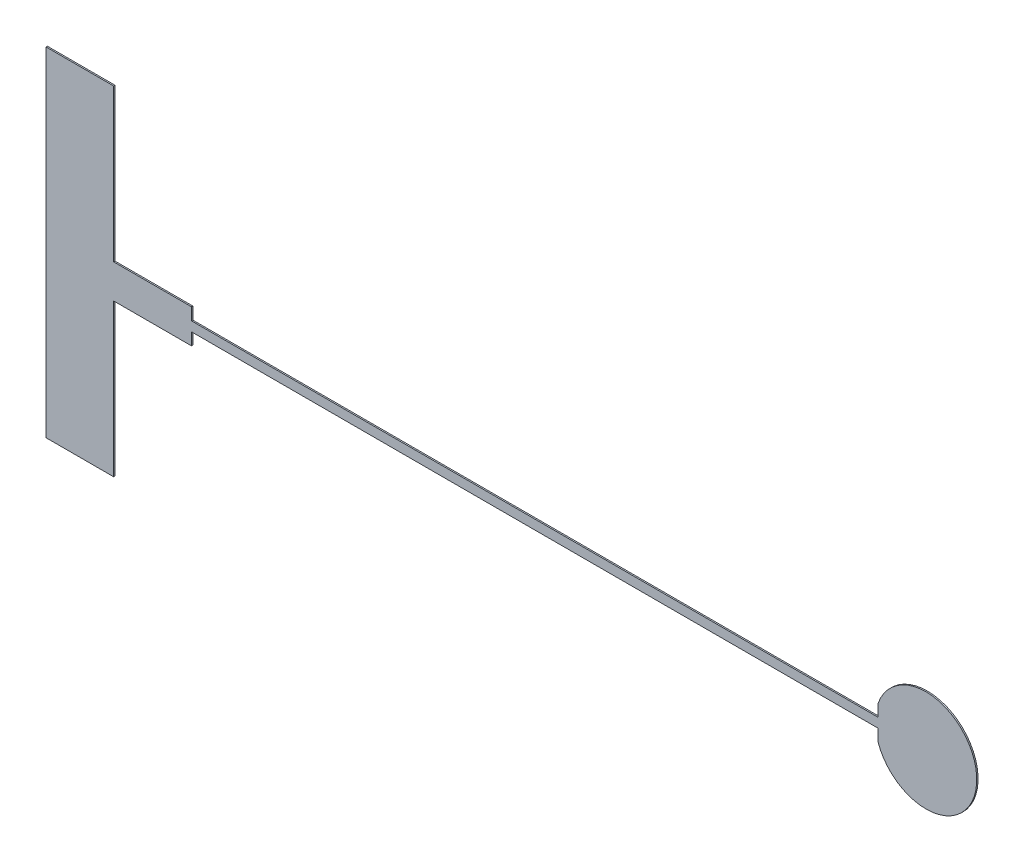
ISO-10303-21;
HEADER;
FILE_DESCRIPTION(('STEP AP214'),'2;1');
FILE_NAME('part.step','',(''),(''),'','','');
FILE_SCHEMA(('AUTOMOTIVE_DESIGN { 1 0 10303 214 1 1 1 1 }'));
ENDSEC;
DATA;
#1=APPLICATION_CONTEXT('core data for automotive mechanical design processes');
#2=APPLICATION_PROTOCOL_DEFINITION('international standard','automotive_design',2000,#1);
#3=PRODUCT_CONTEXT('',#1,'mechanical');
#4=PRODUCT('Part','Part','',(#3));
#5=PRODUCT_RELATED_PRODUCT_CATEGORY('part','',(#4));
#6=PRODUCT_DEFINITION_FORMATION('','',#4);
#7=PRODUCT_DEFINITION_CONTEXT('part definition',#1,'design');
#8=PRODUCT_DEFINITION('design','',#6,#7);
#9=PRODUCT_DEFINITION_SHAPE('','',#8);
#10=(LENGTH_UNIT() NAMED_UNIT(*) SI_UNIT(.MILLI.,.METRE.));
#11=(NAMED_UNIT(*) PLANE_ANGLE_UNIT() SI_UNIT($,.RADIAN.));
#12=(NAMED_UNIT(*) SI_UNIT($,.STERADIAN.) SOLID_ANGLE_UNIT());
#13=UNCERTAINTY_MEASURE_WITH_UNIT(LENGTH_MEASURE(1.E-05),#10,'distance_accuracy_value','');
#14=(GEOMETRIC_REPRESENTATION_CONTEXT(3) GLOBAL_UNCERTAINTY_ASSIGNED_CONTEXT((#13)) GLOBAL_UNIT_ASSIGNED_CONTEXT((#10,
#11,#12)) REPRESENTATION_CONTEXT('',''));
#15=CARTESIAN_POINT('',(0.,0.,0.));
#16=DIRECTION('',(0.,0.,1.));
#17=DIRECTION('',(1.,0.,0.));
#18=AXIS2_PLACEMENT_3D('',#15,#16,#17);
#19=CARTESIAN_POINT('',(1000.,-250.,-20.));
#20=DIRECTION('',(0.,-1.,0.));
#21=DIRECTION('',(1.,0.,0.));
#22=AXIS2_PLACEMENT_3D('',#19,#20,#21);
#23=PLANE('',#22);
#24=DIRECTION('',(1.,0.,0.));
#25=VECTOR('',#24,1.);
#26=CARTESIAN_POINT('',(1000.,-250.,-20.));
#27=LINE('',#26,#25);
#28=CARTESIAN_POINT('',(0.,-250.,-20.));
#29=VERTEX_POINT('',#28);
#30=CARTESIAN_POINT('',(1150.,-250.000000000001,-20.));
#31=VERTEX_POINT('',#30);
#32=EDGE_CURVE('E161',#29,#31,#27,.T.);
#33=ORIENTED_EDGE('',*,*,#32,.T.);
#34=DIRECTION('',(0.,0.,1.));
#35=VECTOR('',#34,1.);
#36=CARTESIAN_POINT('',(1150.,-250.000000000001,-20.));
#37=LINE('',#36,#35);
#38=CARTESIAN_POINT('',(1150.,-250.000000000001,0.));
#39=VERTEX_POINT('',#38);
#40=EDGE_CURVE('E142',#31,#39,#37,.T.);
#41=ORIENTED_EDGE('',*,*,#40,.T.);
#42=DIRECTION('',(1.,0.,0.));
#43=VECTOR('',#42,1.);
#44=CARTESIAN_POINT('',(1000.,-250.,0.));
#45=LINE('',#44,#43);
#46=CARTESIAN_POINT('',(0.,-250.,0.));
#47=VERTEX_POINT('',#46);
#48=EDGE_CURVE('E200',#47,#39,#45,.T.);
#49=ORIENTED_EDGE('',*,*,#48,.F.);
#50=DIRECTION('',(0.,0.,1.));
#51=VECTOR('',#50,1.);
#52=CARTESIAN_POINT('',(0.,-250.,-20.));
#53=LINE('',#52,#51);
#54=EDGE_CURVE('E169',#29,#47,#53,.T.);
#55=ORIENTED_EDGE('',*,*,#54,.F.);
#56=EDGE_LOOP('',(#33,#41,#49,#55));
#57=FACE_BOUND('',#56,.T.);
#58=ADVANCED_FACE('F42',(#57),#23,.T.);
#59=CARTESIAN_POINT('',(12000.,2.44249065417534E-12,-20.));
#60=DIRECTION('',(0.,0.,1.));
#61=DIRECTION('',(1.,0.,0.));
#62=AXIS2_PLACEMENT_3D('',#59,#60,#61);
#63=PLANE('',#62);
#64=DIRECTION('',(0.,1.,0.));
#65=VECTOR('',#64,1.);
#66=CARTESIAN_POINT('',(1150.,-250.000000000001,-20.));
#67=LINE('',#66,#65);
#68=CARTESIAN_POINT('',(1150.,-70.0000000000006,-20.));
#69=VERTEX_POINT('',#68);
#70=EDGE_CURVE('E146',#31,#69,#67,.T.);
#71=ORIENTED_EDGE('',*,*,#70,.F.);
#72=ORIENTED_EDGE('',*,*,#32,.F.);
#73=DIRECTION('',(0.,-1.,0.));
#74=VECTOR('',#73,1.);
#75=CARTESIAN_POINT('',(0.,-2500.,-20.));
#76=LINE('',#75,#74);
#77=CARTESIAN_POINT('',(0.,-2500.,-20.));
#78=VERTEX_POINT('',#77);
#79=EDGE_CURVE('E184',#29,#78,#76,.T.);
#80=ORIENTED_EDGE('',*,*,#79,.T.);
#81=DIRECTION('',(1.,0.,0.));
#82=VECTOR('',#81,1.);
#83=CARTESIAN_POINT('',(-1000.,-2500.,-20.));
#84=LINE('',#83,#82);
#85=CARTESIAN_POINT('',(-1000.,-2500.,-20.));
#86=VERTEX_POINT('',#85);
#87=EDGE_CURVE('E196',#86,#78,#84,.T.);
#88=ORIENTED_EDGE('',*,*,#87,.F.);
#89=DIRECTION('',(0.,-1.,0.));
#90=VECTOR('',#89,1.);
#91=CARTESIAN_POINT('',(-1000.,2500.,-20.));
#92=LINE('',#91,#90);
#93=CARTESIAN_POINT('',(-1000.,2500.,-20.));
#94=VERTEX_POINT('',#93);
#95=EDGE_CURVE('E192',#94,#86,#92,.T.);
#96=ORIENTED_EDGE('',*,*,#95,.F.);
#97=DIRECTION('',(-1.,0.,0.));
#98=VECTOR('',#97,1.);
#99=CARTESIAN_POINT('',(-1000.,2500.,-20.));
#100=LINE('',#99,#98);
#101=CARTESIAN_POINT('',(-4.44089209850063E-13,2500.,-20.));
#102=VERTEX_POINT('',#101);
#103=EDGE_CURVE('E189',#102,#94,#100,.T.);
#104=ORIENTED_EDGE('',*,*,#103,.F.);
#105=DIRECTION('',(0.,-1.,0.));
#106=VECTOR('',#105,1.);
#107=CARTESIAN_POINT('',(-4.44089209850063E-13,2500.,-20.));
#108=LINE('',#107,#106);
#109=CARTESIAN_POINT('',(-2.22044604925031E-13,250.,-20.));
#110=VERTEX_POINT('',#109);
#111=EDGE_CURVE('E245',#102,#110,#108,.T.);
#112=ORIENTED_EDGE('',*,*,#111,.T.);
#113=DIRECTION('',(-1.,0.,0.));
#114=VECTOR('',#113,1.);
#115=CARTESIAN_POINT('',(1000.,250.,-20.));
#116=LINE('',#115,#114);
#117=CARTESIAN_POINT('',(1150.,250.000000000001,-20.));
#118=VERTEX_POINT('',#117);
#119=EDGE_CURVE('E178',#118,#110,#116,.T.);
#120=ORIENTED_EDGE('',*,*,#119,.F.);
#121=DIRECTION('',(0.,-1.,0.));
#122=VECTOR('',#121,1.);
#123=CARTESIAN_POINT('',(1150.,250.000000000001,-20.));
#124=LINE('',#123,#122);
#125=CARTESIAN_POINT('',(1150.,70.0000000000006,-20.));
#126=VERTEX_POINT('',#125);
#127=EDGE_CURVE('E267',#118,#126,#124,.T.);
#128=ORIENTED_EDGE('',*,*,#127,.T.);
#129=DIRECTION('',(1.,0.,0.));
#130=VECTOR('',#129,1.);
#131=CARTESIAN_POINT('',(1150.,70.0000000000006,-20.));
#132=LINE('',#131,#130);
#133=CARTESIAN_POINT('',(11292.8932188135,70.0000000000006,-20.));
#134=VERTEX_POINT('',#133);
#135=EDGE_CURVE('E271',#126,#134,#132,.T.);
#136=ORIENTED_EDGE('',*,*,#135,.T.);
#137=DIRECTION('',(0.,1.,0.));
#138=VECTOR('',#137,1.);
#139=CARTESIAN_POINT('',(11292.8932188135,250.000000000001,-20.));
#140=LINE('',#139,#138);
#141=CARTESIAN_POINT('',(11292.8932188135,250.000000000001,-20.));
#142=VERTEX_POINT('',#141);
#143=EDGE_CURVE('E275',#134,#142,#140,.T.);
#144=ORIENTED_EDGE('',*,*,#143,.T.);
#145=CARTESIAN_POINT('',(12000.,2.44249065417534E-12,-20.));
#146=DIRECTION('',(0.,0.,1.));
#147=DIRECTION('',(1.,0.,0.));
#148=AXIS2_PLACEMENT_3D('',#145,#146,#147);
#149=CIRCLE('',#148,749.999999999999);
#150=CARTESIAN_POINT('',(11292.8932188135,-250.,-20.));
#151=VERTEX_POINT('',#150);
#152=EDGE_CURVE('E172',#151,#142,#149,.T.);
#153=ORIENTED_EDGE('',*,*,#152,.F.);
#154=DIRECTION('',(0.,-1.,0.));
#155=VECTOR('',#154,1.);
#156=CARTESIAN_POINT('',(11292.8932188135,-250.000000000001,-20.));
#157=LINE('',#156,#155);
#158=CARTESIAN_POINT('',(11292.8932188135,-70.0000000000006,-20.));
#159=VERTEX_POINT('',#158);
#160=EDGE_CURVE('E165',#159,#151,#157,.T.);
#161=ORIENTED_EDGE('',*,*,#160,.F.);
#162=DIRECTION('',(1.,0.,0.));
#163=VECTOR('',#162,1.);
#164=CARTESIAN_POINT('',(1150.,-70.0000000000006,-20.));
#165=LINE('',#164,#163);
#166=EDGE_CURVE('E155',#69,#159,#165,.T.);
#167=ORIENTED_EDGE('',*,*,#166,.F.);
#168=EDGE_LOOP('',(#71,#72,#80,#88,#96,#104,#112,#120,#128,#136,#144,#153,#161,#167));
#169=FACE_BOUND('',#168,.T.);
#170=ADVANCED_FACE('F159',(#169),#63,.F.);
#171=CARTESIAN_POINT('',(12000.,2.44249065417534E-12,0.));
#172=DIRECTION('',(0.,0.,1.));
#173=DIRECTION('',(1.,0.,0.));
#174=AXIS2_PLACEMENT_3D('',#171,#172,#173);
#175=PLANE('',#174);
#176=ORIENTED_EDGE('',*,*,#48,.T.);
#177=DIRECTION('',(0.,1.,0.));
#178=VECTOR('',#177,1.);
#179=CARTESIAN_POINT('',(1150.,-250.000000000001,0.));
#180=LINE('',#179,#178);
#181=CARTESIAN_POINT('',(1150.,-70.0000000000006,0.));
#182=VERTEX_POINT('',#181);
#183=EDGE_CURVE('E149',#39,#182,#180,.T.);
#184=ORIENTED_EDGE('',*,*,#183,.T.);
#185=DIRECTION('',(1.,0.,0.));
#186=VECTOR('',#185,1.);
#187=CARTESIAN_POINT('',(1150.,-70.0000000000006,0.));
#188=LINE('',#187,#186);
#189=CARTESIAN_POINT('',(11292.8932188135,-70.0000000000006,0.));
#190=VERTEX_POINT('',#189);
#191=EDGE_CURVE('E166',#182,#190,#188,.T.);
#192=ORIENTED_EDGE('',*,*,#191,.T.);
#193=DIRECTION('',(0.,-1.,0.));
#194=VECTOR('',#193,1.);
#195=CARTESIAN_POINT('',(11292.8932188135,-250.000000000001,0.));
#196=LINE('',#195,#194);
#197=CARTESIAN_POINT('',(11292.8932188135,-250.000000000001,0.));
#198=VERTEX_POINT('',#197);
#199=EDGE_CURVE('E252',#190,#198,#196,.T.);
#200=ORIENTED_EDGE('',*,*,#199,.T.);
#201=CARTESIAN_POINT('',(12000.,2.44249065417534E-12,0.));
#202=DIRECTION('',(0.,0.,1.));
#203=DIRECTION('',(1.,0.,0.));
#204=AXIS2_PLACEMENT_3D('',#201,#202,#203);
#205=CIRCLE('',#204,749.999999999999);
#206=CARTESIAN_POINT('',(11292.8932188135,250.000000000001,0.));
#207=VERTEX_POINT('',#206);
#208=EDGE_CURVE('E203',#198,#207,#205,.T.);
#209=ORIENTED_EDGE('',*,*,#208,.T.);
#210=DIRECTION('',(0.,1.,0.));
#211=VECTOR('',#210,1.);
#212=CARTESIAN_POINT('',(11292.8932188135,250.000000000001,0.));
#213=LINE('',#212,#211);
#214=CARTESIAN_POINT('',(11292.8932188135,70.0000000000006,0.));
#215=VERTEX_POINT('',#214);
#216=EDGE_CURVE('E57',#215,#207,#213,.T.);
#217=ORIENTED_EDGE('',*,*,#216,.F.);
#218=DIRECTION('',(1.,0.,0.));
#219=VECTOR('',#218,1.);
#220=CARTESIAN_POINT('',(1150.,70.0000000000006,0.));
#221=LINE('',#220,#219);
#222=CARTESIAN_POINT('',(1150.,70.0000000000006,0.));
#223=VERTEX_POINT('',#222);
#224=EDGE_CURVE('E283',#223,#215,#221,.T.);
#225=ORIENTED_EDGE('',*,*,#224,.F.);
#226=DIRECTION('',(0.,-1.,0.));
#227=VECTOR('',#226,1.);
#228=CARTESIAN_POINT('',(1150.,250.000000000001,0.));
#229=LINE('',#228,#227);
#230=CARTESIAN_POINT('',(1150.,250.000000000001,0.));
#231=VERTEX_POINT('',#230);
#232=EDGE_CURVE('E264',#231,#223,#229,.T.);
#233=ORIENTED_EDGE('',*,*,#232,.F.);
#234=DIRECTION('',(-1.,0.,0.));
#235=VECTOR('',#234,1.);
#236=CARTESIAN_POINT('',(1000.,250.,0.));
#237=LINE('',#236,#235);
#238=CARTESIAN_POINT('',(-2.22044604925031E-13,250.,0.));
#239=VERTEX_POINT('',#238);
#240=EDGE_CURVE('E208',#231,#239,#237,.T.);
#241=ORIENTED_EDGE('',*,*,#240,.T.);
#242=DIRECTION('',(0.,-1.,0.));
#243=VECTOR('',#242,1.);
#244=CARTESIAN_POINT('',(-4.44089209850063E-13,2500.,0.));
#245=LINE('',#244,#243);
#246=CARTESIAN_POINT('',(0.,2500.,0.));
#247=VERTEX_POINT('',#246);
#248=EDGE_CURVE('E242',#247,#239,#245,.T.);
#249=ORIENTED_EDGE('',*,*,#248,.F.);
#250=DIRECTION('',(-1.,0.,0.));
#251=VECTOR('',#250,1.);
#252=CARTESIAN_POINT('',(-1000.,2500.,0.));
#253=LINE('',#252,#251);
#254=CARTESIAN_POINT('',(-1000.,2500.,0.));
#255=VERTEX_POINT('',#254);
#256=EDGE_CURVE('E211',#247,#255,#253,.T.);
#257=ORIENTED_EDGE('',*,*,#256,.T.);
#258=DIRECTION('',(0.,-1.,0.));
#259=VECTOR('',#258,1.);
#260=CARTESIAN_POINT('',(-1000.,2500.,0.));
#261=LINE('',#260,#259);
#262=CARTESIAN_POINT('',(-1000.,-2500.,0.));
#263=VERTEX_POINT('',#262);
#264=EDGE_CURVE('E181',#255,#263,#261,.T.);
#265=ORIENTED_EDGE('',*,*,#264,.T.);
#266=DIRECTION('',(1.,0.,0.));
#267=VECTOR('',#266,1.);
#268=CARTESIAN_POINT('',(-1000.,-2500.,0.));
#269=LINE('',#268,#267);
#270=CARTESIAN_POINT('',(0.,-2500.,0.));
#271=VERTEX_POINT('',#270);
#272=EDGE_CURVE('E173',#263,#271,#269,.T.);
#273=ORIENTED_EDGE('',*,*,#272,.T.);
#274=DIRECTION('',(0.,-1.,0.));
#275=VECTOR('',#274,1.);
#276=CARTESIAN_POINT('',(0.,-2500.,0.));
#277=LINE('',#276,#275);
#278=EDGE_CURVE('E240',#47,#271,#277,.T.);
#279=ORIENTED_EDGE('',*,*,#278,.F.);
#280=EDGE_LOOP('',(#176,#184,#192,#200,#209,#217,#225,#233,#241,#249,#257,#265,#273,#279));
#281=FACE_BOUND('',#280,.T.);
#282=ADVANCED_FACE('F219',(#281),#175,.T.);
#283=CARTESIAN_POINT('',(-1000.,-2500.,-20.));
#284=DIRECTION('',(0.,-1.,0.));
#285=DIRECTION('',(0.,0.,-1.));
#286=AXIS2_PLACEMENT_3D('',#283,#284,#285);
#287=PLANE('',#286);
#288=DIRECTION('',(0.,0.,1.));
#289=VECTOR('',#288,1.);
#290=CARTESIAN_POINT('',(0.,-2500.,-20.));
#291=LINE('',#290,#289);
#292=EDGE_CURVE('E228',#78,#271,#291,.T.);
#293=ORIENTED_EDGE('',*,*,#292,.T.);
#294=ORIENTED_EDGE('',*,*,#272,.F.);
#295=DIRECTION('',(0.,0.,1.));
#296=VECTOR('',#295,1.);
#297=CARTESIAN_POINT('',(-1000.,-2500.,-20.));
#298=LINE('',#297,#296);
#299=EDGE_CURVE('E11',#86,#263,#298,.T.);
#300=ORIENTED_EDGE('',*,*,#299,.F.);
#301=ORIENTED_EDGE('',*,*,#87,.T.);
#302=EDGE_LOOP('',(#293,#294,#300,#301));
#303=FACE_BOUND('',#302,.T.);
#304=ADVANCED_FACE('F227',(#303),#287,.T.);
#305=CARTESIAN_POINT('',(-1000.,2500.,-20.));
#306=DIRECTION('',(-1.,0.,0.));
#307=DIRECTION('',(0.,-1.,0.));
#308=AXIS2_PLACEMENT_3D('',#305,#306,#307);
#309=PLANE('',#308);
#310=ORIENTED_EDGE('',*,*,#264,.F.);
#311=DIRECTION('',(0.,0.,1.));
#312=VECTOR('',#311,1.);
#313=CARTESIAN_POINT('',(-1000.,2500.,-20.));
#314=LINE('',#313,#312);
#315=EDGE_CURVE('E45',#94,#255,#314,.T.);
#316=ORIENTED_EDGE('',*,*,#315,.F.);
#317=ORIENTED_EDGE('',*,*,#95,.T.);
#318=ORIENTED_EDGE('',*,*,#299,.T.);
#319=EDGE_LOOP('',(#310,#316,#317,#318));
#320=FACE_BOUND('',#319,.T.);
#321=ADVANCED_FACE('F317',(#320),#309,.T.);
#322=CARTESIAN_POINT('',(-1000.,2500.,-20.));
#323=DIRECTION('',(0.,1.,0.));
#324=DIRECTION('',(0.,0.,1.));
#325=AXIS2_PLACEMENT_3D('',#322,#323,#324);
#326=PLANE('',#325);
#327=DIRECTION('',(0.,0.,1.));
#328=VECTOR('',#327,1.);
#329=CARTESIAN_POINT('',(-4.44089209850063E-13,2500.,-20.));
#330=LINE('',#329,#328);
#331=EDGE_CURVE('E65',#102,#247,#330,.T.);
#332=ORIENTED_EDGE('',*,*,#331,.F.);
#333=ORIENTED_EDGE('',*,*,#103,.T.);
#334=ORIENTED_EDGE('',*,*,#315,.T.);
#335=ORIENTED_EDGE('',*,*,#256,.F.);
#336=EDGE_LOOP('',(#332,#333,#334,#335));
#337=FACE_BOUND('',#336,.T.);
#338=ADVANCED_FACE('F314',(#337),#326,.T.);
#339=CARTESIAN_POINT('',(1000.,250.,-20.));
#340=DIRECTION('',(0.,1.,0.));
#341=DIRECTION('',(0.,0.,1.));
#342=AXIS2_PLACEMENT_3D('',#339,#340,#341);
#343=PLANE('',#342);
#344=DIRECTION('',(0.,0.,1.));
#345=VECTOR('',#344,1.);
#346=CARTESIAN_POINT('',(1150.,250.000000000001,-20.));
#347=LINE('',#346,#345);
#348=EDGE_CURVE('E289',#118,#231,#347,.T.);
#349=ORIENTED_EDGE('',*,*,#348,.F.);
#350=ORIENTED_EDGE('',*,*,#119,.T.);
#351=DIRECTION('',(0.,0.,1.));
#352=VECTOR('',#351,1.);
#353=CARTESIAN_POINT('',(-2.22044604925031E-13,250.,-20.));
#354=LINE('',#353,#352);
#355=EDGE_CURVE('E204',#110,#239,#354,.T.);
#356=ORIENTED_EDGE('',*,*,#355,.T.);
#357=ORIENTED_EDGE('',*,*,#240,.F.);
#358=EDGE_LOOP('',(#349,#350,#356,#357));
#359=FACE_BOUND('',#358,.T.);
#360=ADVANCED_FACE('F309',(#359),#343,.T.);
#361=CARTESIAN_POINT('',(12000.,2.44249065417534E-12,-20.));
#362=DIRECTION('',(0.,0.,1.));
#363=DIRECTION('',(1.,0.,0.));
#364=AXIS2_PLACEMENT_3D('',#361,#362,#363);
#365=CYLINDRICAL_SURFACE('',#364,749.999999999999);
#366=DIRECTION('',(0.,0.,1.));
#367=VECTOR('',#366,1.);
#368=CARTESIAN_POINT('',(11292.8932188135,250.,-20.));
#369=LINE('',#368,#367);
#370=EDGE_CURVE('E237',#207,#142,#369,.F.);
#371=ORIENTED_EDGE('',*,*,#370,.F.);
#372=ORIENTED_EDGE('',*,*,#208,.F.);
#373=DIRECTION('',(0.,0.,1.));
#374=VECTOR('',#373,1.);
#375=CARTESIAN_POINT('',(11292.8932188135,-250.,-20.));
#376=LINE('',#375,#374);
#377=EDGE_CURVE('E232',#151,#198,#376,.T.);
#378=ORIENTED_EDGE('',*,*,#377,.F.);
#379=ORIENTED_EDGE('',*,*,#152,.T.);
#380=EDGE_LOOP('',(#371,#372,#378,#379));
#381=FACE_BOUND('',#380,.T.);
#382=ADVANCED_FACE('F329',(#381),#365,.T.);
#383=CARTESIAN_POINT('',(0.,-2500.,-20.));
#384=DIRECTION('',(-1.,0.,0.));
#385=DIRECTION('',(0.,0.,1.));
#386=AXIS2_PLACEMENT_3D('',#383,#384,#385);
#387=PLANE('',#386);
#388=ORIENTED_EDGE('',*,*,#278,.T.);
#389=ORIENTED_EDGE('',*,*,#292,.F.);
#390=ORIENTED_EDGE('',*,*,#79,.F.);
#391=ORIENTED_EDGE('',*,*,#54,.T.);
#392=EDGE_LOOP('',(#388,#389,#390,#391));
#393=FACE_BOUND('',#392,.T.);
#394=ADVANCED_FACE('F248',(#393),#387,.F.);
#395=CARTESIAN_POINT('',(-4.44089209850063E-13,2500.,-20.));
#396=DIRECTION('',(-1.,0.,0.));
#397=DIRECTION('',(0.,-1.,0.));
#398=AXIS2_PLACEMENT_3D('',#395,#396,#397);
#399=PLANE('',#398);
#400=ORIENTED_EDGE('',*,*,#248,.T.);
#401=ORIENTED_EDGE('',*,*,#355,.F.);
#402=ORIENTED_EDGE('',*,*,#111,.F.);
#403=ORIENTED_EDGE('',*,*,#331,.T.);
#404=EDGE_LOOP('',(#400,#401,#402,#403));
#405=FACE_BOUND('',#404,.T.);
#406=ADVANCED_FACE('F311',(#405),#399,.F.);
#407=CARTESIAN_POINT('',(1150.,250.000000000001,-20.));
#408=DIRECTION('',(-1.,0.,0.));
#409=DIRECTION('',(0.,-1.,0.));
#410=AXIS2_PLACEMENT_3D('',#407,#408,#409);
#411=PLANE('',#410);
#412=ORIENTED_EDGE('',*,*,#232,.T.);
#413=DIRECTION('',(0.,0.,1.));
#414=VECTOR('',#413,1.);
#415=CARTESIAN_POINT('',(1150.,70.0000000000006,-20.));
#416=LINE('',#415,#414);
#417=EDGE_CURVE('E279',#126,#223,#416,.T.);
#418=ORIENTED_EDGE('',*,*,#417,.F.);
#419=ORIENTED_EDGE('',*,*,#127,.F.);
#420=ORIENTED_EDGE('',*,*,#348,.T.);
#421=EDGE_LOOP('',(#412,#418,#419,#420));
#422=FACE_BOUND('',#421,.T.);
#423=ADVANCED_FACE('F320',(#422),#411,.F.);
#424=CARTESIAN_POINT('',(11292.8932188135,250.000000000001,-20.));
#425=DIRECTION('',(1.,0.,0.));
#426=DIRECTION('',(0.,0.,-1.));
#427=AXIS2_PLACEMENT_3D('',#424,#425,#426);
#428=PLANE('',#427);
#429=ORIENTED_EDGE('',*,*,#216,.T.);
#430=ORIENTED_EDGE('',*,*,#370,.T.);
#431=ORIENTED_EDGE('',*,*,#143,.F.);
#432=DIRECTION('',(0.,0.,1.));
#433=VECTOR('',#432,1.);
#434=CARTESIAN_POINT('',(11292.8932188135,70.0000000000006,-20.));
#435=LINE('',#434,#433);
#436=EDGE_CURVE('E292',#134,#215,#435,.T.);
#437=ORIENTED_EDGE('',*,*,#436,.T.);
#438=EDGE_LOOP('',(#429,#430,#431,#437));
#439=FACE_BOUND('',#438,.T.);
#440=ADVANCED_FACE('F325',(#439),#428,.F.);
#441=CARTESIAN_POINT('',(1150.,70.0000000000006,-20.));
#442=DIRECTION('',(0.,-1.,0.));
#443=DIRECTION('',(0.,0.,-1.));
#444=AXIS2_PLACEMENT_3D('',#441,#442,#443);
#445=PLANE('',#444);
#446=ORIENTED_EDGE('',*,*,#224,.T.);
#447=ORIENTED_EDGE('',*,*,#436,.F.);
#448=ORIENTED_EDGE('',*,*,#135,.F.);
#449=ORIENTED_EDGE('',*,*,#417,.T.);
#450=EDGE_LOOP('',(#446,#447,#448,#449));
#451=FACE_BOUND('',#450,.T.);
#452=ADVANCED_FACE('F323',(#451),#445,.F.);
#453=CARTESIAN_POINT('',(1150.,-250.000000000001,-20.));
#454=DIRECTION('',(1.,0.,0.));
#455=DIRECTION('',(0.,1.,0.));
#456=AXIS2_PLACEMENT_3D('',#453,#454,#455);
#457=PLANE('',#456);
#458=ORIENTED_EDGE('',*,*,#183,.F.);
#459=ORIENTED_EDGE('',*,*,#40,.F.);
#460=ORIENTED_EDGE('',*,*,#70,.T.);
#461=DIRECTION('',(0.,0.,1.));
#462=VECTOR('',#461,1.);
#463=CARTESIAN_POINT('',(1150.,-70.0000000000006,-20.));
#464=LINE('',#463,#462);
#465=EDGE_CURVE('E261',#69,#182,#464,.T.);
#466=ORIENTED_EDGE('',*,*,#465,.T.);
#467=EDGE_LOOP('',(#458,#459,#460,#466));
#468=FACE_BOUND('',#467,.T.);
#469=ADVANCED_FACE('F144',(#468),#457,.T.);
#470=CARTESIAN_POINT('',(1150.,-70.0000000000006,-20.));
#471=DIRECTION('',(0.,-1.,0.));
#472=DIRECTION('',(0.,0.,-1.));
#473=AXIS2_PLACEMENT_3D('',#470,#471,#472);
#474=PLANE('',#473);
#475=ORIENTED_EDGE('',*,*,#191,.F.);
#476=ORIENTED_EDGE('',*,*,#465,.F.);
#477=ORIENTED_EDGE('',*,*,#166,.T.);
#478=DIRECTION('',(0.,0.,1.));
#479=VECTOR('',#478,1.);
#480=CARTESIAN_POINT('',(11292.8932188135,-70.0000000000006,-20.));
#481=LINE('',#480,#479);
#482=EDGE_CURVE('E154',#159,#190,#481,.T.);
#483=ORIENTED_EDGE('',*,*,#482,.T.);
#484=EDGE_LOOP('',(#475,#476,#477,#483));
#485=FACE_BOUND('',#484,.T.);
#486=ADVANCED_FACE('F338',(#485),#474,.T.);
#487=CARTESIAN_POINT('',(11292.8932188135,-250.000000000001,-20.));
#488=DIRECTION('',(-1.,0.,0.));
#489=DIRECTION('',(0.,0.,1.));
#490=AXIS2_PLACEMENT_3D('',#487,#488,#489);
#491=PLANE('',#490);
#492=ORIENTED_EDGE('',*,*,#199,.F.);
#493=ORIENTED_EDGE('',*,*,#482,.F.);
#494=ORIENTED_EDGE('',*,*,#160,.T.);
#495=ORIENTED_EDGE('',*,*,#377,.T.);
#496=EDGE_LOOP('',(#492,#493,#494,#495));
#497=FACE_BOUND('',#496,.T.);
#498=ADVANCED_FACE('F333',(#497),#491,.T.);
#499=CLOSED_SHELL('',(#58,#170,#282,#304,#321,#338,#360,#382,#394,#406,#423,#440,#452,#469,#486,#498));
#500=MANIFOLD_SOLID_BREP('B2',#499);
#501=ADVANCED_BREP_SHAPE_REPRESENTATION('',(#18,#500),#14);
#502=SHAPE_DEFINITION_REPRESENTATION(#9,#501);
ENDSEC;
END-ISO-10303-21;
